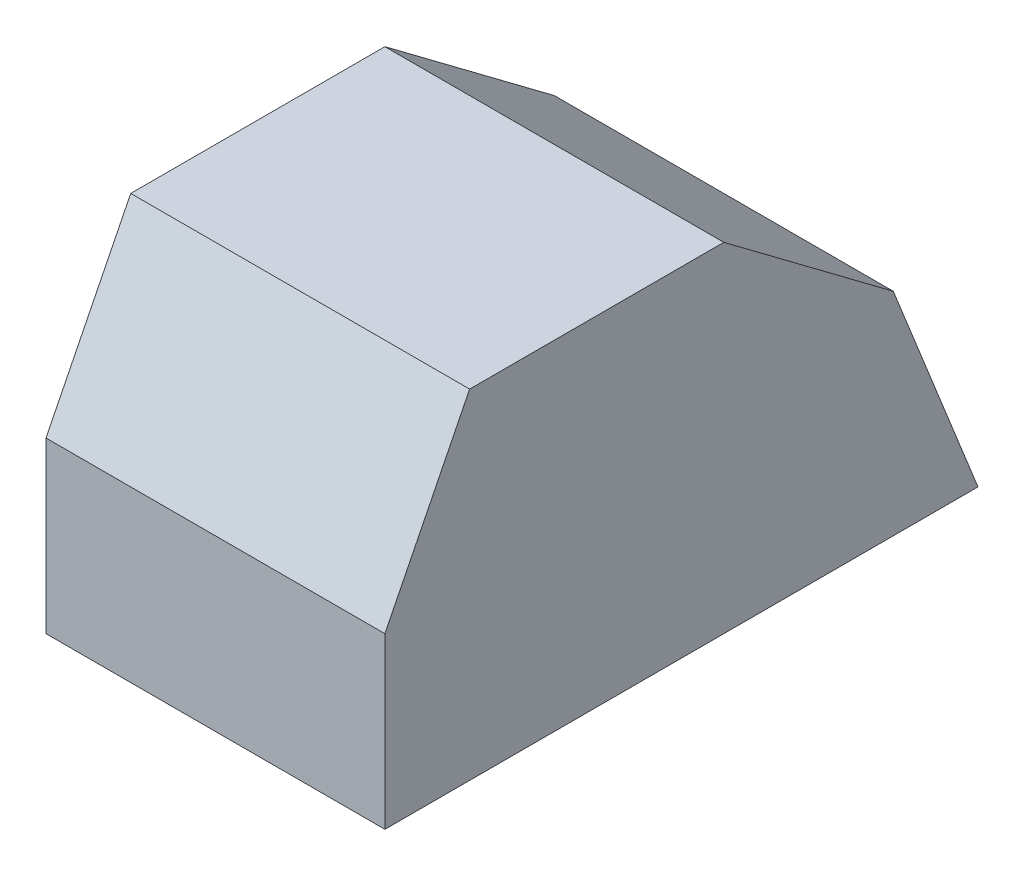
ISO-10303-21;
HEADER;
FILE_DESCRIPTION(('STEP AP214'),'2;1');
FILE_NAME('part.step','',(''),(''),'','','');
FILE_SCHEMA(('AUTOMOTIVE_DESIGN { 1 0 10303 214 1 1 1 1 }'));
ENDSEC;
DATA;
#1=APPLICATION_CONTEXT('core data for automotive mechanical design processes');
#2=APPLICATION_PROTOCOL_DEFINITION('international standard','automotive_design',2000,#1);
#3=PRODUCT_CONTEXT('',#1,'mechanical');
#4=PRODUCT('Part','Part','',(#3));
#5=PRODUCT_RELATED_PRODUCT_CATEGORY('part','',(#4));
#6=PRODUCT_DEFINITION_FORMATION('','',#4);
#7=PRODUCT_DEFINITION_CONTEXT('part definition',#1,'design');
#8=PRODUCT_DEFINITION('design','',#6,#7);
#9=PRODUCT_DEFINITION_SHAPE('','',#8);
#10=(LENGTH_UNIT() NAMED_UNIT(*) SI_UNIT(.MILLI.,.METRE.));
#11=(NAMED_UNIT(*) PLANE_ANGLE_UNIT() SI_UNIT($,.RADIAN.));
#12=(NAMED_UNIT(*) SI_UNIT($,.STERADIAN.) SOLID_ANGLE_UNIT());
#13=UNCERTAINTY_MEASURE_WITH_UNIT(LENGTH_MEASURE(1.E-05),#10,'distance_accuracy_value','');
#14=(GEOMETRIC_REPRESENTATION_CONTEXT(3) GLOBAL_UNCERTAINTY_ASSIGNED_CONTEXT((#13)) GLOBAL_UNIT_ASSIGNED_CONTEXT((#10,
#11,#12)) REPRESENTATION_CONTEXT('',''));
#15=CARTESIAN_POINT('',(0.,0.,0.));
#16=DIRECTION('',(0.,0.,1.));
#17=DIRECTION('',(1.,0.,0.));
#18=AXIS2_PLACEMENT_3D('',#15,#16,#17);
#19=CARTESIAN_POINT('',(40.,20.,0.));
#20=DIRECTION('',(0.,0.,-1.));
#21=DIRECTION('',(-1.,0.,0.));
#22=AXIS2_PLACEMENT_3D('',#19,#20,#21);
#23=PLANE('',#22);
#24=DIRECTION('',(0.,-1.,0.));
#25=VECTOR('',#24,1.);
#26=CARTESIAN_POINT('',(0.,20.,0.));
#27=LINE('',#26,#25);
#28=CARTESIAN_POINT('',(0.,20.,0.));
#29=VERTEX_POINT('',#28);
#30=CARTESIAN_POINT('',(0.,0.,0.));
#31=VERTEX_POINT('',#30);
#32=EDGE_CURVE('E130',#29,#31,#27,.T.);
#33=ORIENTED_EDGE('',*,*,#32,.T.);
#34=DIRECTION('',(-1.,0.,0.));
#35=VECTOR('',#34,1.);
#36=CARTESIAN_POINT('',(40.,0.,0.));
#37=LINE('',#36,#35);
#38=CARTESIAN_POINT('',(40.,0.,0.));
#39=VERTEX_POINT('',#38);
#40=EDGE_CURVE('E11',#39,#31,#37,.T.);
#41=ORIENTED_EDGE('',*,*,#40,.F.);
#42=DIRECTION('',(0.,-1.,0.));
#43=VECTOR('',#42,1.);
#44=CARTESIAN_POINT('',(40.,20.,0.));
#45=LINE('',#44,#43);
#46=CARTESIAN_POINT('',(40.,20.,0.));
#47=VERTEX_POINT('',#46);
#48=EDGE_CURVE('E140',#47,#39,#45,.T.);
#49=ORIENTED_EDGE('',*,*,#48,.F.);
#50=DIRECTION('',(-1.,0.,0.));
#51=VECTOR('',#50,1.);
#52=CARTESIAN_POINT('',(40.,20.,0.));
#53=LINE('',#52,#51);
#54=EDGE_CURVE('E121',#47,#29,#53,.T.);
#55=ORIENTED_EDGE('',*,*,#54,.T.);
#56=EDGE_LOOP('',(#33,#41,#49,#55));
#57=FACE_BOUND('',#56,.T.);
#58=ADVANCED_FACE('F43',(#57),#23,.F.);
#59=CARTESIAN_POINT('',(40.,0.,0.));
#60=DIRECTION('',(0.,1.,0.));
#61=DIRECTION('',(0.,0.,1.));
#62=AXIS2_PLACEMENT_3D('',#59,#60,#61);
#63=PLANE('',#62);
#64=DIRECTION('',(0.,0.,-1.));
#65=VECTOR('',#64,1.);
#66=CARTESIAN_POINT('',(0.,0.,0.));
#67=LINE('',#66,#65);
#68=CARTESIAN_POINT('',(0.,0.,-70.));
#69=VERTEX_POINT('',#68);
#70=EDGE_CURVE('E127',#31,#69,#67,.T.);
#71=ORIENTED_EDGE('',*,*,#70,.T.);
#72=DIRECTION('',(-1.,0.,0.));
#73=VECTOR('',#72,1.);
#74=CARTESIAN_POINT('',(40.,0.,-70.));
#75=LINE('',#74,#73);
#76=CARTESIAN_POINT('',(40.,0.,-70.));
#77=VERTEX_POINT('',#76);
#78=EDGE_CURVE('E51',#77,#69,#75,.T.);
#79=ORIENTED_EDGE('',*,*,#78,.F.);
#80=DIRECTION('',(0.,0.,-1.));
#81=VECTOR('',#80,1.);
#82=CARTESIAN_POINT('',(40.,0.,0.));
#83=LINE('',#82,#81);
#84=EDGE_CURVE('E96',#39,#77,#83,.T.);
#85=ORIENTED_EDGE('',*,*,#84,.F.);
#86=ORIENTED_EDGE('',*,*,#40,.T.);
#87=EDGE_LOOP('',(#71,#79,#85,#86));
#88=FACE_BOUND('',#87,.T.);
#89=ADVANCED_FACE('F161',(#88),#63,.F.);
#90=CARTESIAN_POINT('',(40.,0.,-70.));
#91=DIRECTION('',(0.,-0.371390676354104,0.928476690885259));
#92=DIRECTION('',(0.,-0.928476690885259,-0.371390676354104));
#93=AXIS2_PLACEMENT_3D('',#90,#91,#92);
#94=PLANE('',#93);
#95=DIRECTION('',(0.,0.928476690885259,0.371390676354104));
#96=VECTOR('',#95,1.);
#97=CARTESIAN_POINT('',(0.,0.,-70.));
#98=LINE('',#97,#96);
#99=CARTESIAN_POINT('',(0.,25.,-60.));
#100=VERTEX_POINT('',#99);
#101=EDGE_CURVE('E135',#69,#100,#98,.T.);
#102=ORIENTED_EDGE('',*,*,#101,.T.);
#103=DIRECTION('',(-1.,0.,0.));
#104=VECTOR('',#103,1.);
#105=CARTESIAN_POINT('',(40.,25.,-60.));
#106=LINE('',#105,#104);
#107=CARTESIAN_POINT('',(40.,25.,-60.));
#108=VERTEX_POINT('',#107);
#109=EDGE_CURVE('E119',#108,#100,#106,.T.);
#110=ORIENTED_EDGE('',*,*,#109,.F.);
#111=DIRECTION('',(0.,0.928476690885259,0.371390676354104));
#112=VECTOR('',#111,1.);
#113=CARTESIAN_POINT('',(40.,0.,-70.));
#114=LINE('',#113,#112);
#115=EDGE_CURVE('E108',#77,#108,#114,.T.);
#116=ORIENTED_EDGE('',*,*,#115,.F.);
#117=ORIENTED_EDGE('',*,*,#78,.T.);
#118=EDGE_LOOP('',(#102,#110,#116,#117));
#119=FACE_BOUND('',#118,.T.);
#120=ADVANCED_FACE('F142',(#119),#94,.F.);
#121=CARTESIAN_POINT('',(40.,25.,-60.));
#122=DIRECTION('',(0.,-0.8,0.6));
#123=DIRECTION('',(0.,-0.6,-0.8));
#124=AXIS2_PLACEMENT_3D('',#121,#122,#123);
#125=PLANE('',#124);
#126=DIRECTION('',(0.,0.6,0.8));
#127=VECTOR('',#126,1.);
#128=CARTESIAN_POINT('',(0.,25.,-60.));
#129=LINE('',#128,#127);
#130=CARTESIAN_POINT('',(0.,40.,-40.));
#131=VERTEX_POINT('',#130);
#132=EDGE_CURVE('E117',#100,#131,#129,.T.);
#133=ORIENTED_EDGE('',*,*,#132,.T.);
#134=DIRECTION('',(-1.,0.,0.));
#135=VECTOR('',#134,1.);
#136=CARTESIAN_POINT('',(40.,40.,-40.));
#137=LINE('',#136,#135);
#138=CARTESIAN_POINT('',(40.,40.,-40.));
#139=VERTEX_POINT('',#138);
#140=EDGE_CURVE('E114',#139,#131,#137,.T.);
#141=ORIENTED_EDGE('',*,*,#140,.F.);
#142=DIRECTION('',(0.,0.6,0.8));
#143=VECTOR('',#142,1.);
#144=CARTESIAN_POINT('',(40.,25.,-60.));
#145=LINE('',#144,#143);
#146=EDGE_CURVE('E104',#108,#139,#145,.T.);
#147=ORIENTED_EDGE('',*,*,#146,.F.);
#148=ORIENTED_EDGE('',*,*,#109,.T.);
#149=EDGE_LOOP('',(#133,#141,#147,#148));
#150=FACE_BOUND('',#149,.T.);
#151=ADVANCED_FACE('F113',(#150),#125,.F.);
#152=CARTESIAN_POINT('',(40.,40.,-40.));
#153=DIRECTION('',(0.,-1.,0.));
#154=DIRECTION('',(0.,0.,-1.));
#155=AXIS2_PLACEMENT_3D('',#152,#153,#154);
#156=PLANE('',#155);
#157=DIRECTION('',(0.,0.,1.));
#158=VECTOR('',#157,1.);
#159=CARTESIAN_POINT('',(0.,40.,-40.));
#160=LINE('',#159,#158);
#161=CARTESIAN_POINT('',(0.,40.,-10.));
#162=VERTEX_POINT('',#161);
#163=EDGE_CURVE('E85',#131,#162,#160,.T.);
#164=ORIENTED_EDGE('',*,*,#163,.T.);
#165=DIRECTION('',(-1.,0.,0.));
#166=VECTOR('',#165,1.);
#167=CARTESIAN_POINT('',(40.,40.,-10.));
#168=LINE('',#167,#166);
#169=CARTESIAN_POINT('',(40.,40.,-10.));
#170=VERTEX_POINT('',#169);
#171=EDGE_CURVE('E118',#170,#162,#168,.T.);
#172=ORIENTED_EDGE('',*,*,#171,.F.);
#173=DIRECTION('',(0.,0.,1.));
#174=VECTOR('',#173,1.);
#175=CARTESIAN_POINT('',(40.,40.,-40.));
#176=LINE('',#175,#174);
#177=EDGE_CURVE('E107',#139,#170,#176,.T.);
#178=ORIENTED_EDGE('',*,*,#177,.F.);
#179=ORIENTED_EDGE('',*,*,#140,.T.);
#180=EDGE_LOOP('',(#164,#172,#178,#179));
#181=FACE_BOUND('',#180,.T.);
#182=ADVANCED_FACE('F123',(#181),#156,.F.);
#183=CARTESIAN_POINT('',(40.,40.,-10.));
#184=DIRECTION('',(0.,-0.447213595499958,-0.894427190999916));
#185=DIRECTION('',(0.,0.894427190999916,-0.447213595499958));
#186=AXIS2_PLACEMENT_3D('',#183,#184,#185);
#187=PLANE('',#186);
#188=DIRECTION('',(0.,-0.894427190999916,0.447213595499958));
#189=VECTOR('',#188,1.);
#190=CARTESIAN_POINT('',(0.,40.,-10.));
#191=LINE('',#190,#189);
#192=EDGE_CURVE('E88',#162,#29,#191,.T.);
#193=ORIENTED_EDGE('',*,*,#192,.T.);
#194=ORIENTED_EDGE('',*,*,#54,.F.);
#195=DIRECTION('',(0.,-0.894427190999916,0.447213595499958));
#196=VECTOR('',#195,1.);
#197=CARTESIAN_POINT('',(40.,40.,-10.));
#198=LINE('',#197,#196);
#199=EDGE_CURVE('E56',#170,#47,#198,.T.);
#200=ORIENTED_EDGE('',*,*,#199,.F.);
#201=ORIENTED_EDGE('',*,*,#171,.T.);
#202=EDGE_LOOP('',(#193,#194,#200,#201));
#203=FACE_BOUND('',#202,.T.);
#204=ADVANCED_FACE('F148',(#203),#187,.F.);
#205=CARTESIAN_POINT('',(40.,0.,0.));
#206=DIRECTION('',(1.,0.,0.));
#207=DIRECTION('',(0.,0.,-1.));
#208=AXIS2_PLACEMENT_3D('',#205,#206,#207);
#209=PLANE('',#208);
#210=ORIENTED_EDGE('',*,*,#48,.T.);
#211=ORIENTED_EDGE('',*,*,#84,.T.);
#212=ORIENTED_EDGE('',*,*,#115,.T.);
#213=ORIENTED_EDGE('',*,*,#146,.T.);
#214=ORIENTED_EDGE('',*,*,#177,.T.);
#215=ORIENTED_EDGE('',*,*,#199,.T.);
#216=EDGE_LOOP('',(#210,#211,#212,#213,#214,#215));
#217=FACE_BOUND('',#216,.T.);
#218=ADVANCED_FACE('F103',(#217),#209,.T.);
#219=CARTESIAN_POINT('',(0.,0.,0.));
#220=DIRECTION('',(1.,0.,0.));
#221=DIRECTION('',(0.,0.,-1.));
#222=AXIS2_PLACEMENT_3D('',#219,#220,#221);
#223=PLANE('',#222);
#224=ORIENTED_EDGE('',*,*,#32,.F.);
#225=ORIENTED_EDGE('',*,*,#192,.F.);
#226=ORIENTED_EDGE('',*,*,#163,.F.);
#227=ORIENTED_EDGE('',*,*,#132,.F.);
#228=ORIENTED_EDGE('',*,*,#101,.F.);
#229=ORIENTED_EDGE('',*,*,#70,.F.);
#230=EDGE_LOOP('',(#224,#225,#226,#227,#228,#229));
#231=FACE_BOUND('',#230,.T.);
#232=ADVANCED_FACE('F147',(#231),#223,.F.);
#233=CLOSED_SHELL('',(#58,#89,#120,#151,#182,#204,#218,#232));
#234=MANIFOLD_SOLID_BREP('B2',#233);
#235=ADVANCED_BREP_SHAPE_REPRESENTATION('',(#18,#234),#14);
#236=SHAPE_DEFINITION_REPRESENTATION(#9,#235);
ENDSEC;
END-ISO-10303-21;
